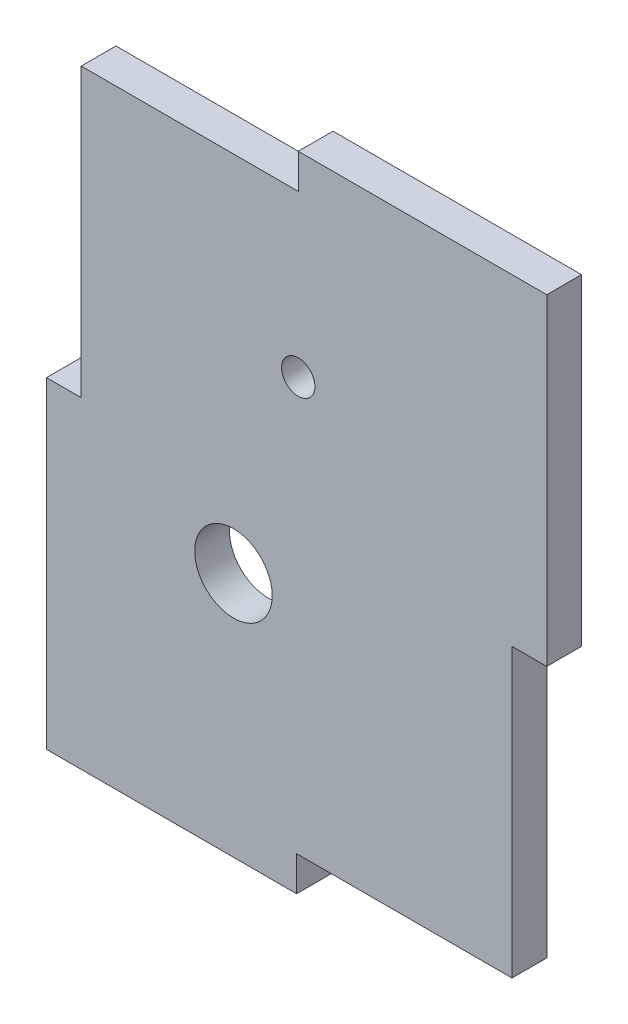
ISO-10303-21;
HEADER;
FILE_DESCRIPTION(('STEP AP214'),'2;1');
FILE_NAME('part.step','',(''),(''),'','','');
FILE_SCHEMA(('AUTOMOTIVE_DESIGN { 1 0 10303 214 1 1 1 1 }'));
ENDSEC;
DATA;
#1=APPLICATION_CONTEXT('core data for automotive mechanical design processes');
#2=APPLICATION_PROTOCOL_DEFINITION('international standard','automotive_design',2000,#1);
#3=PRODUCT_CONTEXT('',#1,'mechanical');
#4=PRODUCT('Part','Part','',(#3));
#5=PRODUCT_RELATED_PRODUCT_CATEGORY('part','',(#4));
#6=PRODUCT_DEFINITION_FORMATION('','',#4);
#7=PRODUCT_DEFINITION_CONTEXT('part definition',#1,'design');
#8=PRODUCT_DEFINITION('design','',#6,#7);
#9=PRODUCT_DEFINITION_SHAPE('','',#8);
#10=(LENGTH_UNIT() NAMED_UNIT(*) SI_UNIT(.MILLI.,.METRE.));
#11=(NAMED_UNIT(*) PLANE_ANGLE_UNIT() SI_UNIT($,.RADIAN.));
#12=(NAMED_UNIT(*) SI_UNIT($,.STERADIAN.) SOLID_ANGLE_UNIT());
#13=UNCERTAINTY_MEASURE_WITH_UNIT(LENGTH_MEASURE(1.E-05),#10,'distance_accuracy_value','');
#14=(GEOMETRIC_REPRESENTATION_CONTEXT(3) GLOBAL_UNCERTAINTY_ASSIGNED_CONTEXT((#13)) GLOBAL_UNIT_ASSIGNED_CONTEXT((#10,
#11,#12)) REPRESENTATION_CONTEXT('',''));
#15=CARTESIAN_POINT('',(0.,0.,0.));
#16=DIRECTION('',(0.,0.,1.));
#17=DIRECTION('',(1.,0.,0.));
#18=AXIS2_PLACEMENT_3D('',#15,#16,#17);
#19=CARTESIAN_POINT('',(19.05,0.,3.0734));
#20=DIRECTION('',(-1.,0.,0.));
#21=DIRECTION('',(0.,-1.,0.));
#22=AXIS2_PLACEMENT_3D('',#19,#20,#21);
#23=PLANE('',#22);
#24=DIRECTION('',(0.,1.,0.));
#25=VECTOR('',#24,1.);
#26=CARTESIAN_POINT('',(19.05,0.,0.));
#27=LINE('',#26,#25);
#28=CARTESIAN_POINT('',(19.05,-3.0734,0.));
#29=VERTEX_POINT('',#28);
#30=CARTESIAN_POINT('',(19.05,0.,0.));
#31=VERTEX_POINT('',#30);
#32=EDGE_CURVE('E160',#29,#31,#27,.T.);
#33=ORIENTED_EDGE('',*,*,#32,.T.);
#34=DIRECTION('',(0.,0.,-1.));
#35=VECTOR('',#34,1.);
#36=CARTESIAN_POINT('',(19.05,0.,3.0734));
#37=LINE('',#36,#35);
#38=CARTESIAN_POINT('',(19.05,0.,3.0734));
#39=VERTEX_POINT('',#38);
#40=EDGE_CURVE('E11',#39,#31,#37,.T.);
#41=ORIENTED_EDGE('',*,*,#40,.F.);
#42=DIRECTION('',(0.,1.,0.));
#43=VECTOR('',#42,1.);
#44=CARTESIAN_POINT('',(19.05,0.,3.0734));
#45=LINE('',#44,#43);
#46=CARTESIAN_POINT('',(19.05,-3.0734,3.0734));
#47=VERTEX_POINT('',#46);
#48=EDGE_CURVE('E195',#47,#39,#45,.T.);
#49=ORIENTED_EDGE('',*,*,#48,.F.);
#50=DIRECTION('',(0.,0.,-1.));
#51=VECTOR('',#50,1.);
#52=CARTESIAN_POINT('',(19.05,-3.0734,3.0734));
#53=LINE('',#52,#51);
#54=EDGE_CURVE('E159',#47,#29,#53,.T.);
#55=ORIENTED_EDGE('',*,*,#54,.T.);
#56=EDGE_LOOP('',(#33,#41,#49,#55));
#57=FACE_BOUND('',#56,.T.);
#58=ADVANCED_FACE('F33',(#57),#23,.F.);
#59=CARTESIAN_POINT('',(0.,0.,3.0734));
#60=DIRECTION('',(0.,1.,0.));
#61=DIRECTION('',(0.,0.,1.));
#62=AXIS2_PLACEMENT_3D('',#59,#60,#61);
#63=PLANE('',#62);
#64=DIRECTION('',(1.,0.,0.));
#65=VECTOR('',#64,1.);
#66=CARTESIAN_POINT('',(0.,0.,0.));
#67=LINE('',#66,#65);
#68=CARTESIAN_POINT('',(38.1,0.,0.));
#69=VERTEX_POINT('',#68);
#70=EDGE_CURVE('E163',#31,#69,#67,.T.);
#71=ORIENTED_EDGE('',*,*,#70,.T.);
#72=DIRECTION('',(0.,0.,-1.));
#73=VECTOR('',#72,1.);
#74=CARTESIAN_POINT('',(38.1,0.,3.0734));
#75=LINE('',#74,#73);
#76=CARTESIAN_POINT('',(38.1,0.,3.0734));
#77=VERTEX_POINT('',#76);
#78=EDGE_CURVE('E41',#77,#69,#75,.T.);
#79=ORIENTED_EDGE('',*,*,#78,.F.);
#80=DIRECTION('',(1.,0.,0.));
#81=VECTOR('',#80,1.);
#82=CARTESIAN_POINT('',(0.,0.,3.0734));
#83=LINE('',#82,#81);
#84=EDGE_CURVE('E104',#39,#77,#83,.T.);
#85=ORIENTED_EDGE('',*,*,#84,.F.);
#86=ORIENTED_EDGE('',*,*,#40,.T.);
#87=EDGE_LOOP('',(#71,#79,#85,#86));
#88=FACE_BOUND('',#87,.T.);
#89=ADVANCED_FACE('F266',(#88),#63,.F.);
#90=CARTESIAN_POINT('',(38.1,0.,3.0734));
#91=DIRECTION('',(-1.,0.,0.));
#92=DIRECTION('',(0.,0.,1.));
#93=AXIS2_PLACEMENT_3D('',#90,#91,#92);
#94=PLANE('',#93);
#95=DIRECTION('',(0.,1.,0.));
#96=VECTOR('',#95,1.);
#97=CARTESIAN_POINT('',(38.1,0.,0.));
#98=LINE('',#97,#96);
#99=CARTESIAN_POINT('',(38.1,25.4,0.));
#100=VERTEX_POINT('',#99);
#101=EDGE_CURVE('E165',#69,#100,#98,.T.);
#102=ORIENTED_EDGE('',*,*,#101,.T.);
#103=DIRECTION('',(0.,0.,-1.));
#104=VECTOR('',#103,1.);
#105=CARTESIAN_POINT('',(38.1,25.4,3.0734));
#106=LINE('',#105,#104);
#107=CARTESIAN_POINT('',(38.1,25.4,3.0734));
#108=VERTEX_POINT('',#107);
#109=EDGE_CURVE('E209',#108,#100,#106,.T.);
#110=ORIENTED_EDGE('',*,*,#109,.F.);
#111=DIRECTION('',(0.,1.,0.));
#112=VECTOR('',#111,1.);
#113=CARTESIAN_POINT('',(38.1,0.,3.0734));
#114=LINE('',#113,#112);
#115=EDGE_CURVE('E216',#77,#108,#114,.T.);
#116=ORIENTED_EDGE('',*,*,#115,.F.);
#117=ORIENTED_EDGE('',*,*,#78,.T.);
#118=EDGE_LOOP('',(#102,#110,#116,#117));
#119=FACE_BOUND('',#118,.T.);
#120=ADVANCED_FACE('F214',(#119),#94,.F.);
#121=CARTESIAN_POINT('',(0.,25.4,3.0734));
#122=DIRECTION('',(0.,-1.,0.));
#123=DIRECTION('',(0.,0.,-1.));
#124=AXIS2_PLACEMENT_3D('',#121,#122,#123);
#125=PLANE('',#124);
#126=DIRECTION('',(-1.,0.,0.));
#127=VECTOR('',#126,1.);
#128=CARTESIAN_POINT('',(0.,25.4,0.));
#129=LINE('',#128,#127);
#130=CARTESIAN_POINT('',(41.1734,25.4,0.));
#131=VERTEX_POINT('',#130);
#132=EDGE_CURVE('E168',#131,#100,#129,.T.);
#133=ORIENTED_EDGE('',*,*,#132,.F.);
#134=DIRECTION('',(0.,0.,-1.));
#135=VECTOR('',#134,1.);
#136=CARTESIAN_POINT('',(41.1734,25.4,3.0734));
#137=LINE('',#136,#135);
#138=CARTESIAN_POINT('',(41.1734,25.4,3.0734));
#139=VERTEX_POINT('',#138);
#140=EDGE_CURVE('E207',#139,#131,#137,.T.);
#141=ORIENTED_EDGE('',*,*,#140,.F.);
#142=DIRECTION('',(-1.,0.,0.));
#143=VECTOR('',#142,1.);
#144=CARTESIAN_POINT('',(0.,25.4,3.0734));
#145=LINE('',#144,#143);
#146=EDGE_CURVE('E227',#139,#108,#145,.T.);
#147=ORIENTED_EDGE('',*,*,#146,.T.);
#148=ORIENTED_EDGE('',*,*,#109,.T.);
#149=EDGE_LOOP('',(#133,#141,#147,#148));
#150=FACE_BOUND('',#149,.T.);
#151=ADVANCED_FACE('F224',(#150),#125,.T.);
#152=CARTESIAN_POINT('',(41.1734,0.,3.0734));
#153=DIRECTION('',(1.,0.,0.));
#154=DIRECTION('',(0.,1.,0.));
#155=AXIS2_PLACEMENT_3D('',#152,#153,#154);
#156=PLANE('',#155);
#157=DIRECTION('',(0.,-1.,0.));
#158=VECTOR('',#157,1.);
#159=CARTESIAN_POINT('',(41.1734,0.,0.));
#160=LINE('',#159,#158);
#161=CARTESIAN_POINT('',(41.1734,53.8734,0.));
#162=VERTEX_POINT('',#161);
#163=EDGE_CURVE('E171',#162,#131,#160,.T.);
#164=ORIENTED_EDGE('',*,*,#163,.F.);
#165=DIRECTION('',(0.,0.,-1.));
#166=VECTOR('',#165,1.);
#167=CARTESIAN_POINT('',(41.1734,53.8734,3.0734));
#168=LINE('',#167,#166);
#169=CARTESIAN_POINT('',(41.1734,53.8734,3.0734));
#170=VERTEX_POINT('',#169);
#171=EDGE_CURVE('E205',#170,#162,#168,.T.);
#172=ORIENTED_EDGE('',*,*,#171,.F.);
#173=DIRECTION('',(0.,-1.,0.));
#174=VECTOR('',#173,1.);
#175=CARTESIAN_POINT('',(41.1734,0.,3.0734));
#176=LINE('',#175,#174);
#177=EDGE_CURVE('E230',#170,#139,#176,.T.);
#178=ORIENTED_EDGE('',*,*,#177,.T.);
#179=ORIENTED_EDGE('',*,*,#140,.T.);
#180=EDGE_LOOP('',(#164,#172,#178,#179));
#181=FACE_BOUND('',#180,.T.);
#182=ADVANCED_FACE('F277',(#181),#156,.T.);
#183=CARTESIAN_POINT('',(0.,53.8734,3.0734));
#184=DIRECTION('',(0.,1.,0.));
#185=DIRECTION('',(0.,0.,1.));
#186=AXIS2_PLACEMENT_3D('',#183,#184,#185);
#187=PLANE('',#186);
#188=DIRECTION('',(1.,0.,0.));
#189=VECTOR('',#188,1.);
#190=CARTESIAN_POINT('',(0.,53.8734,0.));
#191=LINE('',#190,#189);
#192=CARTESIAN_POINT('',(19.1967167483988,53.8734,0.));
#193=VERTEX_POINT('',#192);
#194=EDGE_CURVE('E174',#193,#162,#191,.T.);
#195=ORIENTED_EDGE('',*,*,#194,.F.);
#196=DIRECTION('',(0.,0.,-1.));
#197=VECTOR('',#196,1.);
#198=CARTESIAN_POINT('',(19.1967167483988,53.8734,3.0734));
#199=LINE('',#198,#197);
#200=CARTESIAN_POINT('',(19.1967167483988,53.8734,3.0734));
#201=VERTEX_POINT('',#200);
#202=EDGE_CURVE('E203',#201,#193,#199,.T.);
#203=ORIENTED_EDGE('',*,*,#202,.F.);
#204=DIRECTION('',(1.,0.,0.));
#205=VECTOR('',#204,1.);
#206=CARTESIAN_POINT('',(0.,53.8734,3.0734));
#207=LINE('',#206,#205);
#208=EDGE_CURVE('E232',#201,#170,#207,.T.);
#209=ORIENTED_EDGE('',*,*,#208,.T.);
#210=ORIENTED_EDGE('',*,*,#171,.T.);
#211=EDGE_LOOP('',(#195,#203,#209,#210));
#212=FACE_BOUND('',#211,.T.);
#213=ADVANCED_FACE('F280',(#212),#187,.T.);
#214=CARTESIAN_POINT('',(19.1967167483988,0.,3.0734));
#215=DIRECTION('',(-1.,0.,0.));
#216=DIRECTION('',(0.,0.,1.));
#217=AXIS2_PLACEMENT_3D('',#214,#215,#216);
#218=PLANE('',#217);
#219=DIRECTION('',(0.,1.,0.));
#220=VECTOR('',#219,1.);
#221=CARTESIAN_POINT('',(19.1967167483988,0.,0.));
#222=LINE('',#221,#220);
#223=CARTESIAN_POINT('',(19.1967167483988,50.8,0.));
#224=VERTEX_POINT('',#223);
#225=EDGE_CURVE('E177',#224,#193,#222,.T.);
#226=ORIENTED_EDGE('',*,*,#225,.F.);
#227=DIRECTION('',(0.,0.,-1.));
#228=VECTOR('',#227,1.);
#229=CARTESIAN_POINT('',(19.1967167483988,50.8,3.0734));
#230=LINE('',#229,#228);
#231=CARTESIAN_POINT('',(19.1967167483988,50.8,3.0734));
#232=VERTEX_POINT('',#231);
#233=EDGE_CURVE('E201',#232,#224,#230,.T.);
#234=ORIENTED_EDGE('',*,*,#233,.F.);
#235=DIRECTION('',(0.,1.,0.));
#236=VECTOR('',#235,1.);
#237=CARTESIAN_POINT('',(19.1967167483988,0.,3.0734));
#238=LINE('',#237,#236);
#239=EDGE_CURVE('E239',#232,#201,#238,.T.);
#240=ORIENTED_EDGE('',*,*,#239,.T.);
#241=ORIENTED_EDGE('',*,*,#202,.T.);
#242=EDGE_LOOP('',(#226,#234,#240,#241));
#243=FACE_BOUND('',#242,.T.);
#244=ADVANCED_FACE('F284',(#243),#218,.T.);
#245=CARTESIAN_POINT('',(0.,50.8,3.0734));
#246=DIRECTION('',(0.,1.,0.));
#247=DIRECTION('',(0.,0.,1.));
#248=AXIS2_PLACEMENT_3D('',#245,#246,#247);
#249=PLANE('',#248);
#250=DIRECTION('',(1.,0.,0.));
#251=VECTOR('',#250,1.);
#252=CARTESIAN_POINT('',(0.,50.8,0.));
#253=LINE('',#252,#251);
#254=CARTESIAN_POINT('',(0.,50.8,0.));
#255=VERTEX_POINT('',#254);
#256=EDGE_CURVE('E180',#255,#224,#253,.T.);
#257=ORIENTED_EDGE('',*,*,#256,.F.);
#258=DIRECTION('',(0.,0.,-1.));
#259=VECTOR('',#258,1.);
#260=CARTESIAN_POINT('',(0.,50.8,3.0734));
#261=LINE('',#260,#259);
#262=CARTESIAN_POINT('',(0.,50.8,3.0734));
#263=VERTEX_POINT('',#262);
#264=EDGE_CURVE('E199',#263,#255,#261,.T.);
#265=ORIENTED_EDGE('',*,*,#264,.F.);
#266=DIRECTION('',(1.,0.,0.));
#267=VECTOR('',#266,1.);
#268=CARTESIAN_POINT('',(0.,50.8,3.0734));
#269=LINE('',#268,#267);
#270=EDGE_CURVE('E242',#263,#232,#269,.T.);
#271=ORIENTED_EDGE('',*,*,#270,.T.);
#272=ORIENTED_EDGE('',*,*,#233,.T.);
#273=EDGE_LOOP('',(#257,#265,#271,#272));
#274=FACE_BOUND('',#273,.T.);
#275=ADVANCED_FACE('F288',(#274),#249,.T.);
#276=CARTESIAN_POINT('',(0.,0.,3.0734));
#277=DIRECTION('',(-1.,0.,0.));
#278=DIRECTION('',(0.,0.,1.));
#279=AXIS2_PLACEMENT_3D('',#276,#277,#278);
#280=PLANE('',#279);
#281=DIRECTION('',(0.,1.,0.));
#282=VECTOR('',#281,1.);
#283=CARTESIAN_POINT('',(0.,0.,0.));
#284=LINE('',#283,#282);
#285=CARTESIAN_POINT('',(0.,25.4,0.));
#286=VERTEX_POINT('',#285);
#287=EDGE_CURVE('E183',#286,#255,#284,.T.);
#288=ORIENTED_EDGE('',*,*,#287,.F.);
#289=DIRECTION('',(0.,0.,-1.));
#290=VECTOR('',#289,1.);
#291=CARTESIAN_POINT('',(0.,25.4,3.0734));
#292=LINE('',#291,#290);
#293=CARTESIAN_POINT('',(0.,25.4,3.0734));
#294=VERTEX_POINT('',#293);
#295=EDGE_CURVE('E145',#294,#286,#292,.T.);
#296=ORIENTED_EDGE('',*,*,#295,.F.);
#297=DIRECTION('',(0.,1.,0.));
#298=VECTOR('',#297,1.);
#299=CARTESIAN_POINT('',(0.,0.,3.0734));
#300=LINE('',#299,#298);
#301=EDGE_CURVE('E138',#294,#263,#300,.T.);
#302=ORIENTED_EDGE('',*,*,#301,.T.);
#303=ORIENTED_EDGE('',*,*,#264,.T.);
#304=EDGE_LOOP('',(#288,#296,#302,#303));
#305=FACE_BOUND('',#304,.T.);
#306=ADVANCED_FACE('F246',(#305),#280,.T.);
#307=CARTESIAN_POINT('',(0.,25.4,3.0734));
#308=DIRECTION('',(0.,-1.,0.));
#309=DIRECTION('',(0.,0.,-1.));
#310=AXIS2_PLACEMENT_3D('',#307,#308,#309);
#311=PLANE('',#310);
#312=DIRECTION('',(-1.,0.,0.));
#313=VECTOR('',#312,1.);
#314=CARTESIAN_POINT('',(0.,25.4,0.));
#315=LINE('',#314,#313);
#316=CARTESIAN_POINT('',(-3.0734,25.4,0.));
#317=VERTEX_POINT('',#316);
#318=EDGE_CURVE('E144',#286,#317,#315,.T.);
#319=ORIENTED_EDGE('',*,*,#318,.T.);
#320=DIRECTION('',(0.,0.,-1.));
#321=VECTOR('',#320,1.);
#322=CARTESIAN_POINT('',(-3.0734,25.4,3.0734));
#323=LINE('',#322,#321);
#324=CARTESIAN_POINT('',(-3.0734,25.4,3.0734));
#325=VERTEX_POINT('',#324);
#326=EDGE_CURVE('E141',#325,#317,#323,.T.);
#327=ORIENTED_EDGE('',*,*,#326,.F.);
#328=DIRECTION('',(-1.,0.,0.));
#329=VECTOR('',#328,1.);
#330=CARTESIAN_POINT('',(0.,25.4,3.0734));
#331=LINE('',#330,#329);
#332=EDGE_CURVE('E130',#294,#325,#331,.T.);
#333=ORIENTED_EDGE('',*,*,#332,.F.);
#334=ORIENTED_EDGE('',*,*,#295,.T.);
#335=EDGE_LOOP('',(#319,#327,#333,#334));
#336=FACE_BOUND('',#335,.T.);
#337=ADVANCED_FACE('F142',(#336),#311,.F.);
#338=CARTESIAN_POINT('',(-3.0734,0.,3.0734));
#339=DIRECTION('',(1.,0.,0.));
#340=DIRECTION('',(0.,1.,0.));
#341=AXIS2_PLACEMENT_3D('',#338,#339,#340);
#342=PLANE('',#341);
#343=DIRECTION('',(0.,-1.,0.));
#344=VECTOR('',#343,1.);
#345=CARTESIAN_POINT('',(-3.0734,0.,0.));
#346=LINE('',#345,#344);
#347=CARTESIAN_POINT('',(-3.0734,-3.0734,0.));
#348=VERTEX_POINT('',#347);
#349=EDGE_CURVE('E90',#317,#348,#346,.T.);
#350=ORIENTED_EDGE('',*,*,#349,.T.);
#351=DIRECTION('',(0.,0.,-1.));
#352=VECTOR('',#351,1.);
#353=CARTESIAN_POINT('',(-3.0734,-3.0734,3.0734));
#354=LINE('',#353,#352);
#355=CARTESIAN_POINT('',(-3.0734,-3.0734,3.0734));
#356=VERTEX_POINT('',#355);
#357=EDGE_CURVE('E146',#356,#348,#354,.T.);
#358=ORIENTED_EDGE('',*,*,#357,.F.);
#359=DIRECTION('',(0.,-1.,0.));
#360=VECTOR('',#359,1.);
#361=CARTESIAN_POINT('',(-3.0734,0.,3.0734));
#362=LINE('',#361,#360);
#363=EDGE_CURVE('E135',#325,#356,#362,.T.);
#364=ORIENTED_EDGE('',*,*,#363,.F.);
#365=ORIENTED_EDGE('',*,*,#326,.T.);
#366=EDGE_LOOP('',(#350,#358,#364,#365));
#367=FACE_BOUND('',#366,.T.);
#368=ADVANCED_FACE('F148',(#367),#342,.F.);
#369=CARTESIAN_POINT('',(19.1967167483988,36.57850946853,3.0734));
#370=DIRECTION('',(0.,0.,-1.));
#371=DIRECTION('',(-1.,0.,0.));
#372=AXIS2_PLACEMENT_3D('',#369,#370,#371);
#373=CYLINDRICAL_SURFACE('',#372,1.47319999999999);
#374=CARTESIAN_POINT('',(19.1967167483988,36.57850946853,3.0734));
#375=DIRECTION('',(0.,0.,1.));
#376=DIRECTION('',(1.,0.,0.));
#377=AXIS2_PLACEMENT_3D('',#374,#375,#376);
#378=CIRCLE('',#377,1.47319999999999);
#379=CARTESIAN_POINT('',(20.6699167483987,36.57850946853,3.0734));
#380=VERTEX_POINT('',#379);
#381=EDGE_CURVE('E150',#380,#380,#378,.T.);
#382=ORIENTED_EDGE('',*,*,#381,.T.);
#383=EDGE_LOOP('',(#382));
#384=FACE_BOUND('',#383,.T.);
#385=CARTESIAN_POINT('',(19.1967167483988,36.57850946853,0.));
#386=DIRECTION('',(0.,0.,1.));
#387=DIRECTION('',(1.,0.,0.));
#388=AXIS2_PLACEMENT_3D('',#385,#386,#387);
#389=CIRCLE('',#388,1.47319999999999);
#390=CARTESIAN_POINT('',(20.6699167483987,36.57850946853,0.));
#391=VERTEX_POINT('',#390);
#392=EDGE_CURVE('E189',#391,#391,#389,.T.);
#393=ORIENTED_EDGE('',*,*,#392,.F.);
#394=EDGE_LOOP('',(#393));
#395=FACE_BOUND('',#394,.T.);
#396=ADVANCED_FACE('F254',(#384,#395),#373,.F.);
#397=CARTESIAN_POINT('',(0.,-3.0734,3.0734));
#398=DIRECTION('',(0.,1.,0.));
#399=DIRECTION('',(0.,0.,1.));
#400=AXIS2_PLACEMENT_3D('',#397,#398,#399);
#401=PLANE('',#400);
#402=DIRECTION('',(1.,0.,0.));
#403=VECTOR('',#402,1.);
#404=CARTESIAN_POINT('',(0.,-3.0734,0.));
#405=LINE('',#404,#403);
#406=EDGE_CURVE('E96',#348,#29,#405,.T.);
#407=ORIENTED_EDGE('',*,*,#406,.T.);
#408=ORIENTED_EDGE('',*,*,#54,.F.);
#409=DIRECTION('',(1.,0.,0.));
#410=VECTOR('',#409,1.);
#411=CARTESIAN_POINT('',(0.,-3.0734,3.0734));
#412=LINE('',#411,#410);
#413=EDGE_CURVE('E49',#356,#47,#412,.T.);
#414=ORIENTED_EDGE('',*,*,#413,.F.);
#415=ORIENTED_EDGE('',*,*,#357,.T.);
#416=EDGE_LOOP('',(#407,#408,#414,#415));
#417=FACE_BOUND('',#416,.T.);
#418=ADVANCED_FACE('F251',(#417),#401,.F.);
#419=CARTESIAN_POINT('',(13.4651505673275,18.6777059918142,3.0734));
#420=DIRECTION('',(0.,0.,-1.));
#421=DIRECTION('',(-1.,0.,0.));
#422=AXIS2_PLACEMENT_3D('',#419,#420,#421);
#423=CYLINDRICAL_SURFACE('',#422,3.429);
#424=CARTESIAN_POINT('',(13.4651505673275,18.6777059918142,3.0734));
#425=DIRECTION('',(0.,0.,1.));
#426=DIRECTION('',(1.,0.,0.));
#427=AXIS2_PLACEMENT_3D('',#424,#425,#426);
#428=CIRCLE('',#427,3.429);
#429=CARTESIAN_POINT('',(16.8941505673275,18.6777059918142,3.0734));
#430=VERTEX_POINT('',#429);
#431=EDGE_CURVE('E156',#430,#430,#428,.T.);
#432=ORIENTED_EDGE('',*,*,#431,.T.);
#433=EDGE_LOOP('',(#432));
#434=FACE_BOUND('',#433,.T.);
#435=CARTESIAN_POINT('',(13.4651505673275,18.6777059918142,0.));
#436=DIRECTION('',(0.,0.,1.));
#437=DIRECTION('',(1.,0.,0.));
#438=AXIS2_PLACEMENT_3D('',#435,#436,#437);
#439=CIRCLE('',#438,3.429);
#440=CARTESIAN_POINT('',(16.8941505673275,18.6777059918142,0.));
#441=VERTEX_POINT('',#440);
#442=EDGE_CURVE('E192',#441,#441,#439,.T.);
#443=ORIENTED_EDGE('',*,*,#442,.F.);
#444=EDGE_LOOP('',(#443));
#445=FACE_BOUND('',#444,.T.);
#446=ADVANCED_FACE('F253',(#434,#445),#423,.F.);
#447=CARTESIAN_POINT('',(0.,0.,3.0734));
#448=DIRECTION('',(0.,0.,1.));
#449=DIRECTION('',(1.,0.,0.));
#450=AXIS2_PLACEMENT_3D('',#447,#448,#449);
#451=PLANE('',#450);
#452=ORIENTED_EDGE('',*,*,#48,.T.);
#453=ORIENTED_EDGE('',*,*,#84,.T.);
#454=ORIENTED_EDGE('',*,*,#115,.T.);
#455=ORIENTED_EDGE('',*,*,#146,.F.);
#456=ORIENTED_EDGE('',*,*,#177,.F.);
#457=ORIENTED_EDGE('',*,*,#208,.F.);
#458=ORIENTED_EDGE('',*,*,#239,.F.);
#459=ORIENTED_EDGE('',*,*,#270,.F.);
#460=ORIENTED_EDGE('',*,*,#301,.F.);
#461=ORIENTED_EDGE('',*,*,#332,.T.);
#462=ORIENTED_EDGE('',*,*,#363,.T.);
#463=ORIENTED_EDGE('',*,*,#413,.T.);
#464=EDGE_LOOP('',(#452,#453,#454,#455,#456,#457,#458,#459,#460,#461,#462,#463));
#465=FACE_BOUND('',#464,.T.);
#466=ORIENTED_EDGE('',*,*,#381,.F.);
#467=EDGE_LOOP('',(#466));
#468=FACE_BOUND('',#467,.T.);
#469=ORIENTED_EDGE('',*,*,#431,.F.);
#470=EDGE_LOOP('',(#469));
#471=FACE_BOUND('',#470,.T.);
#472=ADVANCED_FACE('F132',(#465,#468,#471),#451,.T.);
#473=CARTESIAN_POINT('',(0.,0.,0.));
#474=DIRECTION('',(0.,0.,1.));
#475=DIRECTION('',(1.,0.,0.));
#476=AXIS2_PLACEMENT_3D('',#473,#474,#475);
#477=PLANE('',#476);
#478=ORIENTED_EDGE('',*,*,#32,.F.);
#479=ORIENTED_EDGE('',*,*,#406,.F.);
#480=ORIENTED_EDGE('',*,*,#349,.F.);
#481=ORIENTED_EDGE('',*,*,#318,.F.);
#482=ORIENTED_EDGE('',*,*,#287,.T.);
#483=ORIENTED_EDGE('',*,*,#256,.T.);
#484=ORIENTED_EDGE('',*,*,#225,.T.);
#485=ORIENTED_EDGE('',*,*,#194,.T.);
#486=ORIENTED_EDGE('',*,*,#163,.T.);
#487=ORIENTED_EDGE('',*,*,#132,.T.);
#488=ORIENTED_EDGE('',*,*,#101,.F.);
#489=ORIENTED_EDGE('',*,*,#70,.F.);
#490=EDGE_LOOP('',(#478,#479,#480,#481,#482,#483,#484,#485,#486,#487,#488,#489));
#491=FACE_BOUND('',#490,.T.);
#492=ORIENTED_EDGE('',*,*,#392,.T.);
#493=EDGE_LOOP('',(#492));
#494=FACE_BOUND('',#493,.T.);
#495=ORIENTED_EDGE('',*,*,#442,.T.);
#496=EDGE_LOOP('',(#495));
#497=FACE_BOUND('',#496,.T.);
#498=ADVANCED_FACE('F219',(#491,#494,#497),#477,.F.);
#499=CLOSED_SHELL('',(#58,#89,#120,#151,#182,#213,#244,#275,#306,#337,#368,#396,#418,#446,#472,#498));
#500=MANIFOLD_SOLID_BREP('B2',#499);
#501=ADVANCED_BREP_SHAPE_REPRESENTATION('',(#18,#500),#14);
#502=SHAPE_DEFINITION_REPRESENTATION(#9,#501);
ENDSEC;
END-ISO-10303-21;
